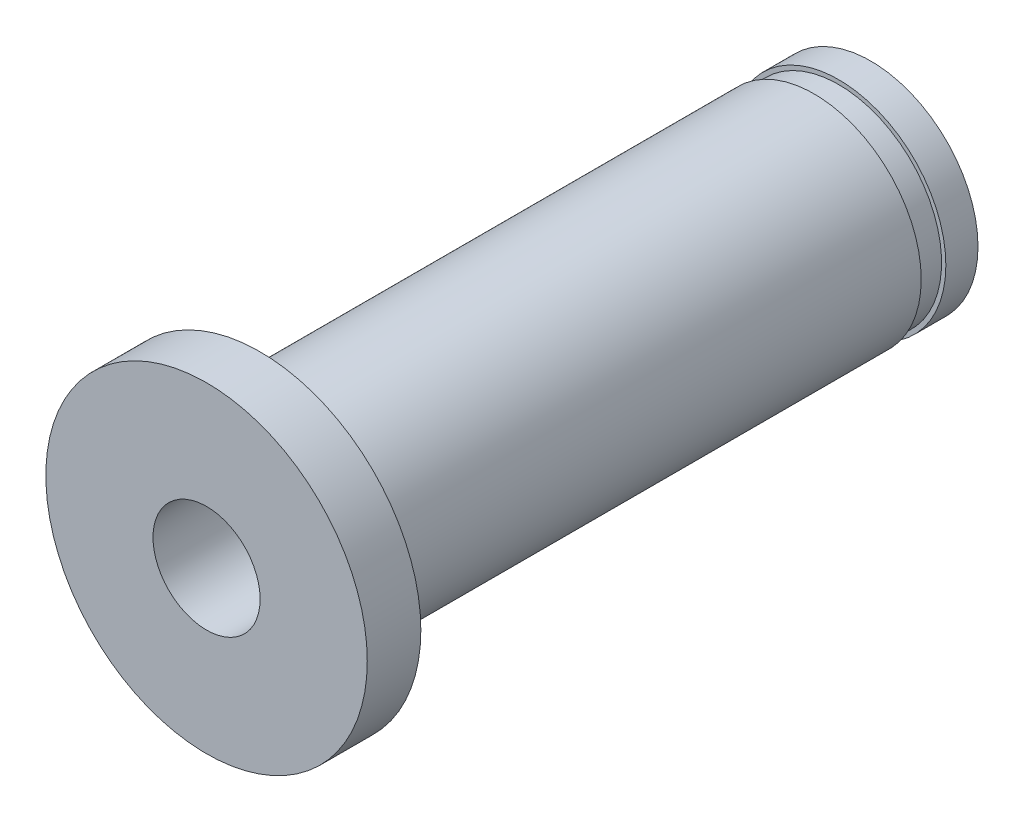
ISO-10303-21;
HEADER;
FILE_DESCRIPTION(('STEP AP214'),'2;1');
FILE_NAME('part.step','',(''),(''),'','','');
FILE_SCHEMA(('AUTOMOTIVE_DESIGN { 1 0 10303 214 1 1 1 1 }'));
ENDSEC;
DATA;
#1=APPLICATION_CONTEXT('core data for automotive mechanical design processes');
#2=APPLICATION_PROTOCOL_DEFINITION('international standard','automotive_design',2000,#1);
#3=PRODUCT_CONTEXT('',#1,'mechanical');
#4=PRODUCT('Part','Part','',(#3));
#5=PRODUCT_RELATED_PRODUCT_CATEGORY('part','',(#4));
#6=PRODUCT_DEFINITION_FORMATION('','',#4);
#7=PRODUCT_DEFINITION_CONTEXT('part definition',#1,'design');
#8=PRODUCT_DEFINITION('design','',#6,#7);
#9=PRODUCT_DEFINITION_SHAPE('','',#8);
#10=(LENGTH_UNIT() NAMED_UNIT(*) SI_UNIT(.MILLI.,.METRE.));
#11=(NAMED_UNIT(*) PLANE_ANGLE_UNIT() SI_UNIT($,.RADIAN.));
#12=(NAMED_UNIT(*) SI_UNIT($,.STERADIAN.) SOLID_ANGLE_UNIT());
#13=UNCERTAINTY_MEASURE_WITH_UNIT(LENGTH_MEASURE(1.E-05),#10,'distance_accuracy_value','');
#14=(GEOMETRIC_REPRESENTATION_CONTEXT(3) GLOBAL_UNCERTAINTY_ASSIGNED_CONTEXT((#13)) GLOBAL_UNIT_ASSIGNED_CONTEXT((#10,
#11,#12)) REPRESENTATION_CONTEXT('',''));
#15=CARTESIAN_POINT('',(0.,0.,0.));
#16=DIRECTION('',(0.,0.,1.));
#17=DIRECTION('',(1.,0.,0.));
#18=AXIS2_PLACEMENT_3D('',#15,#16,#17);
#19=CARTESIAN_POINT('',(0.,0.,31.));
#20=DIRECTION('',(0.,0.,-1.));
#21=DIRECTION('',(-1.,0.,0.));
#22=AXIS2_PLACEMENT_3D('',#19,#20,#21);
#23=CYLINDRICAL_SURFACE('',#22,5.);
#24=CARTESIAN_POINT('',(0.,0.,28.5));
#25=DIRECTION('',(0.,0.,1.));
#26=DIRECTION('',(1.,0.,0.));
#27=AXIS2_PLACEMENT_3D('',#24,#25,#26);
#28=CIRCLE('',#27,5.);
#29=CARTESIAN_POINT('',(5.,0.,28.5));
#30=VERTEX_POINT('',#29);
#31=EDGE_CURVE('E10',#30,#30,#28,.T.);
#32=ORIENTED_EDGE('',*,*,#31,.F.);
#33=EDGE_LOOP('',(#32));
#34=FACE_BOUND('',#33,.T.);
#35=CARTESIAN_POINT('',(0.,0.,2.65));
#36=DIRECTION('',(0.,0.,-1.));
#37=DIRECTION('',(-1.,0.,0.));
#38=AXIS2_PLACEMENT_3D('',#35,#36,#37);
#39=CIRCLE('',#38,5.);
#40=CARTESIAN_POINT('',(-5.,0.,2.65));
#41=VERTEX_POINT('',#40);
#42=EDGE_CURVE('E53',#41,#41,#39,.T.);
#43=ORIENTED_EDGE('',*,*,#42,.F.);
#44=EDGE_LOOP('',(#43));
#45=FACE_BOUND('',#44,.T.);
#46=ADVANCED_FACE('F49',(#34,#45),#23,.T.);
#47=CARTESIAN_POINT('',(0.,0.,1.5));
#48=DIRECTION('',(0.,0.,-1.));
#49=DIRECTION('',(-1.,0.,0.));
#50=AXIS2_PLACEMENT_3D('',#47,#48,#49);
#51=CIRCLE('',#50,5.);
#52=CARTESIAN_POINT('',(-5.,0.,1.5));
#53=VERTEX_POINT('',#52);
#54=EDGE_CURVE('E66',#53,#53,#51,.T.);
#55=ORIENTED_EDGE('',*,*,#54,.T.);
#56=EDGE_LOOP('',(#55));
#57=FACE_BOUND('',#56,.T.);
#58=CARTESIAN_POINT('',(0.,0.,0.));
#59=DIRECTION('',(0.,0.,1.));
#60=DIRECTION('',(1.,0.,0.));
#61=AXIS2_PLACEMENT_3D('',#58,#59,#60);
#62=CIRCLE('',#61,5.);
#63=CARTESIAN_POINT('',(5.,0.,0.));
#64=VERTEX_POINT('',#63);
#65=EDGE_CURVE('E57',#64,#64,#62,.T.);
#66=ORIENTED_EDGE('',*,*,#65,.T.);
#67=EDGE_LOOP('',(#66));
#68=FACE_BOUND('',#67,.T.);
#69=ADVANCED_FACE('F51',(#57,#68),#23,.T.);
#70=CARTESIAN_POINT('',(0.,0.,31.));
#71=DIRECTION('',(0.,0.,1.));
#72=DIRECTION('',(1.,0.,0.));
#73=AXIS2_PLACEMENT_3D('',#70,#71,#72);
#74=PLANE('',#73);
#75=CARTESIAN_POINT('',(0.,0.,31.));
#76=DIRECTION('',(0.,0.,1.));
#77=DIRECTION('',(1.,0.,0.));
#78=AXIS2_PLACEMENT_3D('',#75,#76,#77);
#79=CIRCLE('',#78,2.49999999999999);
#80=CARTESIAN_POINT('',(2.49999999999999,0.,31.));
#81=VERTEX_POINT('',#80);
#82=EDGE_CURVE('E84',#81,#81,#79,.T.);
#83=ORIENTED_EDGE('',*,*,#82,.F.);
#84=EDGE_LOOP('',(#83));
#85=FACE_BOUND('',#84,.T.);
#86=CARTESIAN_POINT('',(0.,0.,31.));
#87=DIRECTION('',(0.,0.,1.));
#88=DIRECTION('',(1.,0.,0.));
#89=AXIS2_PLACEMENT_3D('',#86,#87,#88);
#90=CIRCLE('',#89,7.5);
#91=CARTESIAN_POINT('',(7.5,0.,31.));
#92=VERTEX_POINT('',#91);
#93=EDGE_CURVE('E72',#92,#92,#90,.T.);
#94=ORIENTED_EDGE('',*,*,#93,.T.);
#95=EDGE_LOOP('',(#94));
#96=FACE_BOUND('',#95,.T.);
#97=ADVANCED_FACE('F110',(#85,#96),#74,.T.);
#98=CARTESIAN_POINT('',(0.,0.,0.));
#99=DIRECTION('',(0.,0.,1.));
#100=DIRECTION('',(1.,0.,0.));
#101=AXIS2_PLACEMENT_3D('',#98,#99,#100);
#102=PLANE('',#101);
#103=CARTESIAN_POINT('',(0.,0.,0.));
#104=DIRECTION('',(0.,0.,-1.));
#105=DIRECTION('',(-1.,0.,0.));
#106=AXIS2_PLACEMENT_3D('',#103,#104,#105);
#107=CIRCLE('',#106,2.5);
#108=CARTESIAN_POINT('',(-2.5,0.,0.));
#109=VERTEX_POINT('',#108);
#110=EDGE_CURVE('E92',#109,#109,#107,.T.);
#111=ORIENTED_EDGE('',*,*,#110,.F.);
#112=EDGE_LOOP('',(#111));
#113=FACE_BOUND('',#112,.T.);
#114=ORIENTED_EDGE('',*,*,#65,.F.);
#115=EDGE_LOOP('',(#114));
#116=FACE_BOUND('',#115,.T.);
#117=ADVANCED_FACE('F107',(#113,#116),#102,.F.);
#118=CARTESIAN_POINT('',(0.,0.,15.));
#119=DIRECTION('',(0.,0.,-1.));
#120=DIRECTION('',(-1.,0.,0.));
#121=AXIS2_PLACEMENT_3D('',#118,#119,#120);
#122=CONICAL_SURFACE('',#121,2.5,1.02974425867665);
#123=CARTESIAN_POINT('',(0.,0.,15.5));
#124=DIRECTION('',(0.,0.,1.));
#125=DIRECTION('',(1.,0.,0.));
#126=AXIS2_PLACEMENT_3D('',#123,#124,#125);
#127=CIRCLE('',#126,1.66786025882474);
#128=CARTESIAN_POINT('',(1.66786025882474,0.,15.5));
#129=VERTEX_POINT('',#128);
#130=EDGE_CURVE('E65',#129,#129,#127,.T.);
#131=ORIENTED_EDGE('',*,*,#130,.T.);
#132=EDGE_LOOP('',(#131));
#133=FACE_BOUND('',#132,.T.);
#134=CARTESIAN_POINT('',(0.,0.,15.));
#135=DIRECTION('',(0.,0.,-1.));
#136=DIRECTION('',(-1.,0.,0.));
#137=AXIS2_PLACEMENT_3D('',#134,#135,#136);
#138=CIRCLE('',#137,2.5);
#139=CARTESIAN_POINT('',(-2.5,0.,15.));
#140=VERTEX_POINT('',#139);
#141=EDGE_CURVE('E62',#140,#140,#138,.T.);
#142=ORIENTED_EDGE('',*,*,#141,.T.);
#143=EDGE_LOOP('',(#142));
#144=FACE_BOUND('',#143,.T.);
#145=ADVANCED_FACE('F98',(#133,#144),#122,.F.);
#146=CARTESIAN_POINT('',(0.,0.,0.));
#147=DIRECTION('',(0.,0.,-1.));
#148=DIRECTION('',(-1.,0.,0.));
#149=AXIS2_PLACEMENT_3D('',#146,#147,#148);
#150=CYLINDRICAL_SURFACE('',#149,2.5);
#151=ORIENTED_EDGE('',*,*,#141,.F.);
#152=EDGE_LOOP('',(#151));
#153=FACE_BOUND('',#152,.T.);
#154=ORIENTED_EDGE('',*,*,#110,.T.);
#155=EDGE_LOOP('',(#154));
#156=FACE_BOUND('',#155,.T.);
#157=ADVANCED_FACE('F100',(#153,#156),#150,.F.);
#158=CARTESIAN_POINT('',(0.,0.,16.));
#159=DIRECTION('',(0.,0.,1.));
#160=DIRECTION('',(1.,0.,0.));
#161=AXIS2_PLACEMENT_3D('',#158,#159,#160);
#162=CONICAL_SURFACE('',#161,2.5,1.02974425867665);
#163=CARTESIAN_POINT('',(0.,0.,16.));
#164=DIRECTION('',(0.,0.,1.));
#165=DIRECTION('',(1.,0.,0.));
#166=AXIS2_PLACEMENT_3D('',#163,#164,#165);
#167=CIRCLE('',#166,2.5);
#168=CARTESIAN_POINT('',(2.5,0.,16.));
#169=VERTEX_POINT('',#168);
#170=EDGE_CURVE('E89',#169,#169,#167,.T.);
#171=ORIENTED_EDGE('',*,*,#170,.T.);
#172=EDGE_LOOP('',(#171));
#173=FACE_BOUND('',#172,.T.);
#174=ORIENTED_EDGE('',*,*,#130,.F.);
#175=EDGE_LOOP('',(#174));
#176=FACE_BOUND('',#175,.T.);
#177=ADVANCED_FACE('F103',(#173,#176),#162,.F.);
#178=CARTESIAN_POINT('',(0.,0.,31.));
#179=DIRECTION('',(0.,0.,1.));
#180=DIRECTION('',(1.,0.,0.));
#181=AXIS2_PLACEMENT_3D('',#178,#179,#180);
#182=CYLINDRICAL_SURFACE('',#181,2.49999999999999);
#183=ORIENTED_EDGE('',*,*,#170,.F.);
#184=EDGE_LOOP('',(#183));
#185=FACE_BOUND('',#184,.T.);
#186=ORIENTED_EDGE('',*,*,#82,.T.);
#187=EDGE_LOOP('',(#186));
#188=FACE_BOUND('',#187,.T.);
#189=ADVANCED_FACE('F145',(#185,#188),#182,.F.);
#190=CARTESIAN_POINT('',(0.,0.,28.5));
#191=DIRECTION('',(0.,0.,1.));
#192=DIRECTION('',(1.,0.,0.));
#193=AXIS2_PLACEMENT_3D('',#190,#191,#192);
#194=CYLINDRICAL_SURFACE('',#193,7.5);
#195=CARTESIAN_POINT('',(0.,0.,28.5));
#196=DIRECTION('',(0.,0.,1.));
#197=DIRECTION('',(1.,0.,0.));
#198=AXIS2_PLACEMENT_3D('',#195,#196,#197);
#199=CIRCLE('',#198,7.5);
#200=CARTESIAN_POINT('',(7.5,0.,28.5));
#201=VERTEX_POINT('',#200);
#202=EDGE_CURVE('E81',#201,#201,#199,.T.);
#203=ORIENTED_EDGE('',*,*,#202,.T.);
#204=EDGE_LOOP('',(#203));
#205=FACE_BOUND('',#204,.T.);
#206=ORIENTED_EDGE('',*,*,#93,.F.);
#207=EDGE_LOOP('',(#206));
#208=FACE_BOUND('',#207,.T.);
#209=ADVANCED_FACE('F139',(#205,#208),#194,.T.);
#210=CARTESIAN_POINT('',(0.,0.,28.5));
#211=DIRECTION('',(0.,0.,1.));
#212=DIRECTION('',(1.,0.,0.));
#213=AXIS2_PLACEMENT_3D('',#210,#211,#212);
#214=PLANE('',#213);
#215=ORIENTED_EDGE('',*,*,#31,.T.);
#216=EDGE_LOOP('',(#215));
#217=FACE_BOUND('',#216,.T.);
#218=ORIENTED_EDGE('',*,*,#202,.F.);
#219=EDGE_LOOP('',(#218));
#220=FACE_BOUND('',#219,.T.);
#221=ADVANCED_FACE('F130',(#217,#220),#214,.F.);
#222=CARTESIAN_POINT('',(0.,0.,2.65));
#223=DIRECTION('',(0.,0.,-1.));
#224=DIRECTION('',(-1.,0.,0.));
#225=AXIS2_PLACEMENT_3D('',#222,#223,#224);
#226=PLANE('',#225);
#227=CARTESIAN_POINT('',(0.,0.,2.65));
#228=DIRECTION('',(0.,0.,-1.));
#229=DIRECTION('',(-1.,0.,0.));
#230=AXIS2_PLACEMENT_3D('',#227,#228,#229);
#231=CIRCLE('',#230,4.8);
#232=CARTESIAN_POINT('',(-4.8,0.,2.65));
#233=VERTEX_POINT('',#232);
#234=EDGE_CURVE('E68',#233,#233,#231,.T.);
#235=ORIENTED_EDGE('',*,*,#234,.F.);
#236=EDGE_LOOP('',(#235));
#237=FACE_BOUND('',#236,.T.);
#238=ORIENTED_EDGE('',*,*,#42,.T.);
#239=EDGE_LOOP('',(#238));
#240=FACE_BOUND('',#239,.T.);
#241=ADVANCED_FACE('F128',(#237,#240),#226,.T.);
#242=CARTESIAN_POINT('',(0.,0.,1.5));
#243=DIRECTION('',(0.,0.,-1.));
#244=DIRECTION('',(-1.,0.,0.));
#245=AXIS2_PLACEMENT_3D('',#242,#243,#244);
#246=PLANE('',#245);
#247=CARTESIAN_POINT('',(0.,0.,1.5));
#248=DIRECTION('',(0.,0.,-1.));
#249=DIRECTION('',(-1.,0.,0.));
#250=AXIS2_PLACEMENT_3D('',#247,#248,#249);
#251=CIRCLE('',#250,4.8);
#252=CARTESIAN_POINT('',(-4.8,0.,1.5));
#253=VERTEX_POINT('',#252);
#254=EDGE_CURVE('E74',#253,#253,#251,.T.);
#255=ORIENTED_EDGE('',*,*,#254,.T.);
#256=EDGE_LOOP('',(#255));
#257=FACE_BOUND('',#256,.T.);
#258=ORIENTED_EDGE('',*,*,#54,.F.);
#259=EDGE_LOOP('',(#258));
#260=FACE_BOUND('',#259,.T.);
#261=ADVANCED_FACE('F129',(#257,#260),#246,.F.);
#262=CARTESIAN_POINT('',(0.,0.,2.65));
#263=DIRECTION('',(0.,0.,-1.));
#264=DIRECTION('',(-1.,0.,0.));
#265=AXIS2_PLACEMENT_3D('',#262,#263,#264);
#266=CYLINDRICAL_SURFACE('',#265,4.8);
#267=ORIENTED_EDGE('',*,*,#234,.T.);
#268=EDGE_LOOP('',(#267));
#269=FACE_BOUND('',#268,.T.);
#270=ORIENTED_EDGE('',*,*,#254,.F.);
#271=EDGE_LOOP('',(#270));
#272=FACE_BOUND('',#271,.T.);
#273=ADVANCED_FACE('F136',(#269,#272),#266,.T.);
#274=CLOSED_SHELL('',(#46,#69,#97,#117,#145,#157,#177,#189,#209,#221,#241,#261,#273));
#275=MANIFOLD_SOLID_BREP('B2',#274);
#276=ADVANCED_BREP_SHAPE_REPRESENTATION('',(#18,#275),#14);
#277=SHAPE_DEFINITION_REPRESENTATION(#9,#276);
ENDSEC;
END-ISO-10303-21;
